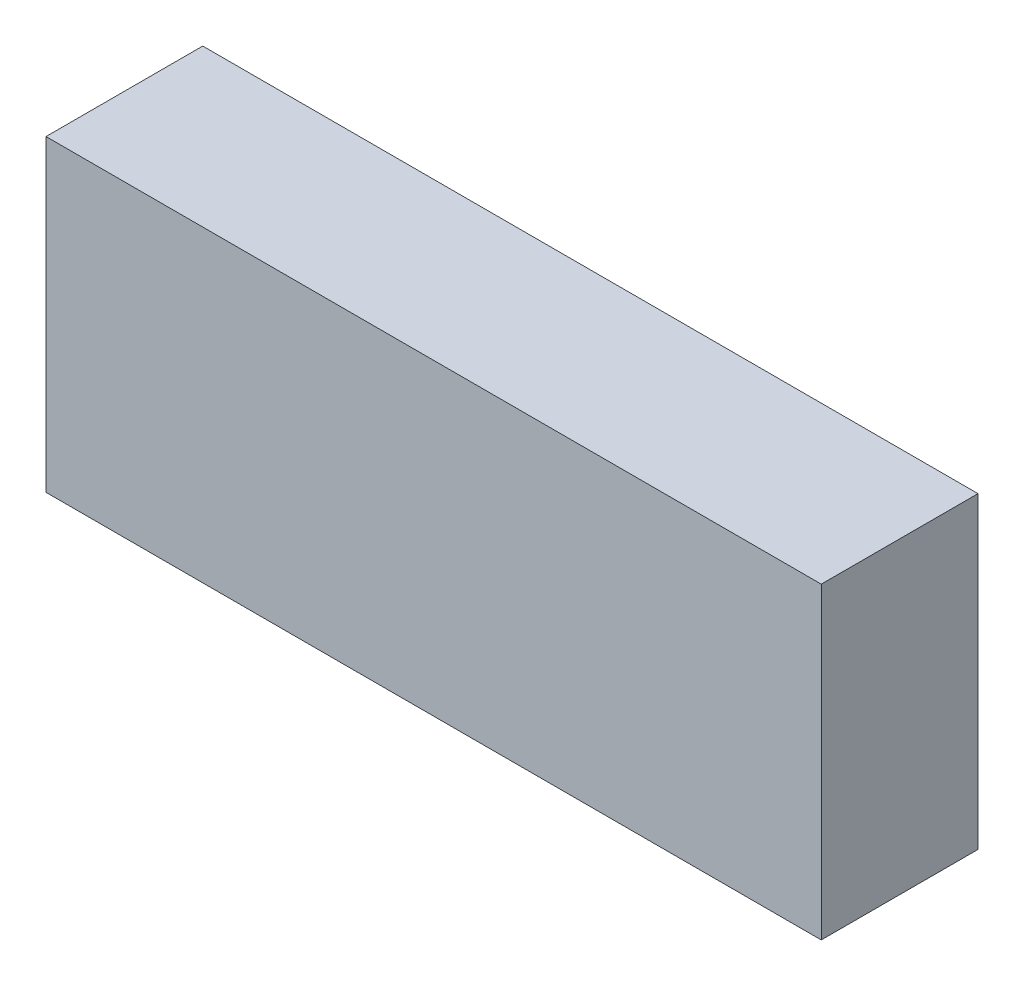
ISO-10303-21;
HEADER;
FILE_DESCRIPTION(('STEP AP214'),'2;1');
FILE_NAME('part.step','',(''),(''),'','','');
FILE_SCHEMA(('AUTOMOTIVE_DESIGN { 1 0 10303 214 1 1 1 1 }'));
ENDSEC;
DATA;
#1=APPLICATION_CONTEXT('core data for automotive mechanical design processes');
#2=APPLICATION_PROTOCOL_DEFINITION('international standard','automotive_design',2000,#1);
#3=PRODUCT_CONTEXT('',#1,'mechanical');
#4=PRODUCT('Part','Part','',(#3));
#5=PRODUCT_RELATED_PRODUCT_CATEGORY('part','',(#4));
#6=PRODUCT_DEFINITION_FORMATION('','',#4);
#7=PRODUCT_DEFINITION_CONTEXT('part definition',#1,'design');
#8=PRODUCT_DEFINITION('design','',#6,#7);
#9=PRODUCT_DEFINITION_SHAPE('','',#8);
#10=(LENGTH_UNIT() NAMED_UNIT(*) SI_UNIT(.MILLI.,.METRE.));
#11=(NAMED_UNIT(*) PLANE_ANGLE_UNIT() SI_UNIT($,.RADIAN.));
#12=(NAMED_UNIT(*) SI_UNIT($,.STERADIAN.) SOLID_ANGLE_UNIT());
#13=UNCERTAINTY_MEASURE_WITH_UNIT(LENGTH_MEASURE(1.E-05),#10,'distance_accuracy_value','');
#14=(GEOMETRIC_REPRESENTATION_CONTEXT(3) GLOBAL_UNCERTAINTY_ASSIGNED_CONTEXT((#13)) GLOBAL_UNIT_ASSIGNED_CONTEXT((#10,
#11,#12)) REPRESENTATION_CONTEXT('',''));
#15=CARTESIAN_POINT('',(0.,0.,0.));
#16=DIRECTION('',(0.,0.,1.));
#17=DIRECTION('',(1.,0.,0.));
#18=AXIS2_PLACEMENT_3D('',#15,#16,#17);
#19=CARTESIAN_POINT('',(-2.473,-0.983,1.));
#20=DIRECTION('',(1.,0.,0.));
#21=DIRECTION('',(0.,0.,-1.));
#22=AXIS2_PLACEMENT_3D('',#19,#20,#21);
#23=PLANE('',#22);
#24=DIRECTION('',(0.,-1.,0.));
#25=VECTOR('',#24,1.);
#26=CARTESIAN_POINT('',(-2.473,-0.983,0.));
#27=LINE('',#26,#25);
#28=CARTESIAN_POINT('',(-2.473,0.983,0.));
#29=VERTEX_POINT('',#28);
#30=CARTESIAN_POINT('',(-2.473,-0.983,0.));
#31=VERTEX_POINT('',#30);
#32=EDGE_CURVE('E96',#29,#31,#27,.T.);
#33=ORIENTED_EDGE('',*,*,#32,.T.);
#34=DIRECTION('',(0.,0.,-1.));
#35=VECTOR('',#34,1.);
#36=CARTESIAN_POINT('',(-2.473,-0.983,1.));
#37=LINE('',#36,#35);
#38=CARTESIAN_POINT('',(-2.473,-0.983,1.));
#39=VERTEX_POINT('',#38);
#40=EDGE_CURVE('E11',#39,#31,#37,.T.);
#41=ORIENTED_EDGE('',*,*,#40,.F.);
#42=DIRECTION('',(0.,-1.,0.));
#43=VECTOR('',#42,1.);
#44=CARTESIAN_POINT('',(-2.473,-0.983,1.));
#45=LINE('',#44,#43);
#46=CARTESIAN_POINT('',(-2.473,0.983,1.));
#47=VERTEX_POINT('',#46);
#48=EDGE_CURVE('E84',#47,#39,#45,.T.);
#49=ORIENTED_EDGE('',*,*,#48,.F.);
#50=DIRECTION('',(0.,0.,-1.));
#51=VECTOR('',#50,1.);
#52=CARTESIAN_POINT('',(-2.473,0.983,1.));
#53=LINE('',#52,#51);
#54=EDGE_CURVE('E92',#47,#29,#53,.T.);
#55=ORIENTED_EDGE('',*,*,#54,.T.);
#56=EDGE_LOOP('',(#33,#41,#49,#55));
#57=FACE_BOUND('',#56,.T.);
#58=ADVANCED_FACE('F33',(#57),#23,.F.);
#59=CARTESIAN_POINT('',(2.473,-0.983,1.));
#60=DIRECTION('',(0.,1.,0.));
#61=DIRECTION('',(0.,0.,1.));
#62=AXIS2_PLACEMENT_3D('',#59,#60,#61);
#63=PLANE('',#62);
#64=DIRECTION('',(1.,0.,0.));
#65=VECTOR('',#64,1.);
#66=CARTESIAN_POINT('',(2.473,-0.983,0.));
#67=LINE('',#66,#65);
#68=CARTESIAN_POINT('',(2.473,-0.983,0.));
#69=VERTEX_POINT('',#68);
#70=EDGE_CURVE('E88',#31,#69,#67,.T.);
#71=ORIENTED_EDGE('',*,*,#70,.T.);
#72=DIRECTION('',(0.,0.,-1.));
#73=VECTOR('',#72,1.);
#74=CARTESIAN_POINT('',(2.473,-0.983,1.));
#75=LINE('',#74,#73);
#76=CARTESIAN_POINT('',(2.473,-0.983,1.));
#77=VERTEX_POINT('',#76);
#78=EDGE_CURVE('E41',#77,#69,#75,.T.);
#79=ORIENTED_EDGE('',*,*,#78,.F.);
#80=DIRECTION('',(1.,0.,0.));
#81=VECTOR('',#80,1.);
#82=CARTESIAN_POINT('',(2.473,-0.983,1.));
#83=LINE('',#82,#81);
#84=EDGE_CURVE('E79',#39,#77,#83,.T.);
#85=ORIENTED_EDGE('',*,*,#84,.F.);
#86=ORIENTED_EDGE('',*,*,#40,.T.);
#87=EDGE_LOOP('',(#71,#79,#85,#86));
#88=FACE_BOUND('',#87,.T.);
#89=ADVANCED_FACE('F87',(#88),#63,.F.);
#90=CARTESIAN_POINT('',(2.473,0.983,1.));
#91=DIRECTION('',(-1.,0.,0.));
#92=DIRECTION('',(0.,0.,1.));
#93=AXIS2_PLACEMENT_3D('',#90,#91,#92);
#94=PLANE('',#93);
#95=DIRECTION('',(0.,1.,0.));
#96=VECTOR('',#95,1.);
#97=CARTESIAN_POINT('',(2.473,0.983,0.));
#98=LINE('',#97,#96);
#99=CARTESIAN_POINT('',(2.473,0.983,0.));
#100=VERTEX_POINT('',#99);
#101=EDGE_CURVE('E66',#69,#100,#98,.T.);
#102=ORIENTED_EDGE('',*,*,#101,.T.);
#103=DIRECTION('',(0.,0.,-1.));
#104=VECTOR('',#103,1.);
#105=CARTESIAN_POINT('',(2.473,0.983,1.));
#106=LINE('',#105,#104);
#107=CARTESIAN_POINT('',(2.473,0.983,1.));
#108=VERTEX_POINT('',#107);
#109=EDGE_CURVE('E89',#108,#100,#106,.T.);
#110=ORIENTED_EDGE('',*,*,#109,.F.);
#111=DIRECTION('',(0.,1.,0.));
#112=VECTOR('',#111,1.);
#113=CARTESIAN_POINT('',(2.473,0.983,1.));
#114=LINE('',#113,#112);
#115=EDGE_CURVE('E82',#77,#108,#114,.T.);
#116=ORIENTED_EDGE('',*,*,#115,.F.);
#117=ORIENTED_EDGE('',*,*,#78,.T.);
#118=EDGE_LOOP('',(#102,#110,#116,#117));
#119=FACE_BOUND('',#118,.T.);
#120=ADVANCED_FACE('F90',(#119),#94,.F.);
#121=CARTESIAN_POINT('',(-2.473,0.983,1.));
#122=DIRECTION('',(0.,-1.,0.));
#123=DIRECTION('',(0.,0.,-1.));
#124=AXIS2_PLACEMENT_3D('',#121,#122,#123);
#125=PLANE('',#124);
#126=DIRECTION('',(-1.,0.,0.));
#127=VECTOR('',#126,1.);
#128=CARTESIAN_POINT('',(-2.473,0.983,0.));
#129=LINE('',#128,#127);
#130=EDGE_CURVE('E72',#100,#29,#129,.T.);
#131=ORIENTED_EDGE('',*,*,#130,.T.);
#132=ORIENTED_EDGE('',*,*,#54,.F.);
#133=DIRECTION('',(-1.,0.,0.));
#134=VECTOR('',#133,1.);
#135=CARTESIAN_POINT('',(-2.473,0.983,1.));
#136=LINE('',#135,#134);
#137=EDGE_CURVE('E49',#108,#47,#136,.T.);
#138=ORIENTED_EDGE('',*,*,#137,.F.);
#139=ORIENTED_EDGE('',*,*,#109,.T.);
#140=EDGE_LOOP('',(#131,#132,#138,#139));
#141=FACE_BOUND('',#140,.T.);
#142=ADVANCED_FACE('F103',(#141),#125,.F.);
#143=CARTESIAN_POINT('',(0.,0.,1.));
#144=DIRECTION('',(0.,0.,-1.));
#145=DIRECTION('',(-1.,0.,0.));
#146=AXIS2_PLACEMENT_3D('',#143,#144,#145);
#147=PLANE('',#146);
#148=ORIENTED_EDGE('',*,*,#48,.T.);
#149=ORIENTED_EDGE('',*,*,#84,.T.);
#150=ORIENTED_EDGE('',*,*,#115,.T.);
#151=ORIENTED_EDGE('',*,*,#137,.T.);
#152=EDGE_LOOP('',(#148,#149,#150,#151));
#153=FACE_BOUND('',#152,.T.);
#154=ADVANCED_FACE('F80',(#153),#147,.F.);
#155=CARTESIAN_POINT('',(0.,0.,0.));
#156=DIRECTION('',(0.,0.,-1.));
#157=DIRECTION('',(-1.,0.,0.));
#158=AXIS2_PLACEMENT_3D('',#155,#156,#157);
#159=PLANE('',#158);
#160=ORIENTED_EDGE('',*,*,#32,.F.);
#161=ORIENTED_EDGE('',*,*,#130,.F.);
#162=ORIENTED_EDGE('',*,*,#101,.F.);
#163=ORIENTED_EDGE('',*,*,#70,.F.);
#164=EDGE_LOOP('',(#160,#161,#162,#163));
#165=FACE_BOUND('',#164,.T.);
#166=ADVANCED_FACE('F106',(#165),#159,.T.);
#167=CLOSED_SHELL('',(#58,#89,#120,#142,#154,#166));
#168=MANIFOLD_SOLID_BREP('B2',#167);
#169=ADVANCED_BREP_SHAPE_REPRESENTATION('',(#18,#168),#14);
#170=SHAPE_DEFINITION_REPRESENTATION(#9,#169);
ENDSEC;
END-ISO-10303-21;
